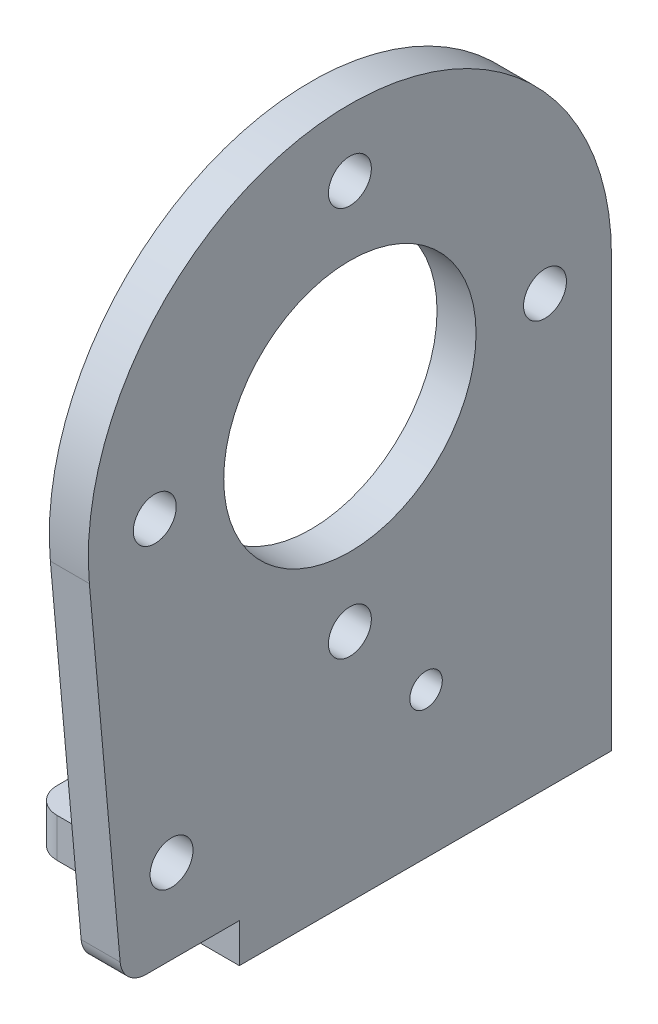
ISO-10303-21;
HEADER;
FILE_DESCRIPTION(('STEP AP214'),'2;1');
FILE_NAME('part.step','',(''),(''),'','','');
FILE_SCHEMA(('AUTOMOTIVE_DESIGN { 1 0 10303 214 1 1 1 1 }'));
ENDSEC;
DATA;
#1=APPLICATION_CONTEXT('core data for automotive mechanical design processes');
#2=APPLICATION_PROTOCOL_DEFINITION('international standard','automotive_design',2000,#1);
#3=PRODUCT_CONTEXT('',#1,'mechanical');
#4=PRODUCT('Part','Part','',(#3));
#5=PRODUCT_RELATED_PRODUCT_CATEGORY('part','',(#4));
#6=PRODUCT_DEFINITION_FORMATION('','',#4);
#7=PRODUCT_DEFINITION_CONTEXT('part definition',#1,'design');
#8=PRODUCT_DEFINITION('design','',#6,#7);
#9=PRODUCT_DEFINITION_SHAPE('','',#8);
#10=(LENGTH_UNIT() NAMED_UNIT(*) SI_UNIT(.MILLI.,.METRE.));
#11=(NAMED_UNIT(*) PLANE_ANGLE_UNIT() SI_UNIT($,.RADIAN.));
#12=(NAMED_UNIT(*) SI_UNIT($,.STERADIAN.) SOLID_ANGLE_UNIT());
#13=UNCERTAINTY_MEASURE_WITH_UNIT(LENGTH_MEASURE(1.E-05),#10,'distance_accuracy_value','');
#14=(GEOMETRIC_REPRESENTATION_CONTEXT(3) GLOBAL_UNCERTAINTY_ASSIGNED_CONTEXT((#13)) GLOBAL_UNIT_ASSIGNED_CONTEXT((#10,
#11,#12)) REPRESENTATION_CONTEXT('',''));
#15=CARTESIAN_POINT('',(0.,0.,0.));
#16=DIRECTION('',(0.,0.,1.));
#17=DIRECTION('',(1.,0.,0.));
#18=AXIS2_PLACEMENT_3D('',#15,#16,#17);
#19=CARTESIAN_POINT('',(-16.,0.,-9.));
#20=DIRECTION('',(0.,0.,-1.));
#21=DIRECTION('',(-1.,0.,0.));
#22=AXIS2_PLACEMENT_3D('',#19,#20,#21);
#23=PLANE('',#22);
#24=DIRECTION('',(1.,0.,0.));
#25=VECTOR('',#24,1.);
#26=CARTESIAN_POINT('',(-16.,13.,-9.));
#27=LINE('',#26,#25);
#28=CARTESIAN_POINT('',(-14.,13.,-9.));
#29=VERTEX_POINT('',#28);
#30=CARTESIAN_POINT('',(-3.,13.,-9.));
#31=VERTEX_POINT('',#30);
#32=EDGE_CURVE('E219',#29,#31,#27,.T.);
#33=ORIENTED_EDGE('',*,*,#32,.F.);
#34=DIRECTION('',(0.,1.,0.));
#35=VECTOR('',#34,1.);
#36=CARTESIAN_POINT('',(-14.,0.,-9.));
#37=LINE('',#36,#35);
#38=CARTESIAN_POINT('',(-14.,10.,-9.));
#39=VERTEX_POINT('',#38);
#40=EDGE_CURVE('E250',#29,#39,#37,.F.);
#41=ORIENTED_EDGE('',*,*,#40,.T.);
#42=DIRECTION('',(1.,0.,0.));
#43=VECTOR('',#42,1.);
#44=CARTESIAN_POINT('',(-16.,10.,-9.));
#45=LINE('',#44,#43);
#46=CARTESIAN_POINT('',(0.,10.,-9.));
#47=VERTEX_POINT('',#46);
#48=EDGE_CURVE('E210',#39,#47,#45,.T.);
#49=ORIENTED_EDGE('',*,*,#48,.T.);
#50=DIRECTION('',(0.,1.,0.));
#51=VECTOR('',#50,1.);
#52=CARTESIAN_POINT('',(0.,0.,-9.));
#53=LINE('',#52,#51);
#54=CARTESIAN_POINT('',(0.,13.,-9.));
#55=VERTEX_POINT('',#54);
#56=EDGE_CURVE('E211',#47,#55,#53,.T.);
#57=ORIENTED_EDGE('',*,*,#56,.T.);
#58=EDGE_CURVE('E222',#31,#55,#27,.T.);
#59=ORIENTED_EDGE('',*,*,#58,.F.);
#60=EDGE_LOOP('',(#33,#41,#49,#57,#59));
#61=FACE_BOUND('',#60,.T.);
#62=ADVANCED_FACE('F37',(#61),#23,.F.);
#63=CARTESIAN_POINT('',(-16.,13.,0.));
#64=DIRECTION('',(0.,-1.,0.));
#65=DIRECTION('',(0.,0.,-1.));
#66=AXIS2_PLACEMENT_3D('',#63,#64,#65);
#67=PLANE('',#66);
#68=CARTESIAN_POINT('',(-11.65,13.,-22.35));
#69=DIRECTION('',(0.,1.,0.));
#70=DIRECTION('',(0.,0.,1.));
#71=AXIS2_PLACEMENT_3D('',#68,#69,#70);
#72=CIRCLE('',#71,1.65);
#73=CARTESIAN_POINT('',(-11.65,13.,-20.7));
#74=VERTEX_POINT('',#73);
#75=EDGE_CURVE('E192',#74,#74,#72,.T.);
#76=ORIENTED_EDGE('',*,*,#75,.F.);
#77=EDGE_LOOP('',(#76));
#78=FACE_BOUND('',#77,.T.);
#79=CARTESIAN_POINT('',(-11.65,13.,-13.6));
#80=DIRECTION('',(0.,1.,0.));
#81=DIRECTION('',(0.,0.,1.));
#82=AXIS2_PLACEMENT_3D('',#79,#80,#81);
#83=CIRCLE('',#82,1.65);
#84=CARTESIAN_POINT('',(-11.65,13.,-11.95));
#85=VERTEX_POINT('',#84);
#86=EDGE_CURVE('E190',#85,#85,#83,.T.);
#87=ORIENTED_EDGE('',*,*,#86,.F.);
#88=EDGE_LOOP('',(#87));
#89=FACE_BOUND('',#88,.T.);
#90=CARTESIAN_POINT('',(-11.65,13.,-31.1));
#91=DIRECTION('',(0.,1.,0.));
#92=DIRECTION('',(0.,0.,1.));
#93=AXIS2_PLACEMENT_3D('',#90,#91,#92);
#94=CIRCLE('',#93,1.65);
#95=CARTESIAN_POINT('',(-11.65,13.,-29.45));
#96=VERTEX_POINT('',#95);
#97=EDGE_CURVE('E198',#96,#96,#94,.T.);
#98=ORIENTED_EDGE('',*,*,#97,.F.);
#99=EDGE_LOOP('',(#98));
#100=FACE_BOUND('',#99,.T.);
#101=DIRECTION('',(1.,0.,0.));
#102=VECTOR('',#101,1.);
#103=CARTESIAN_POINT('',(-16.,13.,-37.61033589));
#104=LINE('',#103,#102);
#105=CARTESIAN_POINT('',(-14.,13.,-37.61033589));
#106=VERTEX_POINT('',#105);
#107=CARTESIAN_POINT('',(-3.,13.,-37.61033589));
#108=VERTEX_POINT('',#107);
#109=EDGE_CURVE('E223',#106,#108,#104,.T.);
#110=ORIENTED_EDGE('',*,*,#109,.F.);
#111=CARTESIAN_POINT('',(-14.,13.,-35.61033589));
#112=DIRECTION('',(0.,-1.,0.));
#113=DIRECTION('',(0.,0.,-1.));
#114=AXIS2_PLACEMENT_3D('',#111,#112,#113);
#115=CIRCLE('',#114,2.);
#116=CARTESIAN_POINT('',(-16.,13.,-35.61033589));
#117=VERTEX_POINT('',#116);
#118=EDGE_CURVE('E248',#106,#117,#115,.F.);
#119=ORIENTED_EDGE('',*,*,#118,.T.);
#120=DIRECTION('',(0.,0.,-1.));
#121=VECTOR('',#120,1.);
#122=CARTESIAN_POINT('',(-16.,13.,0.));
#123=LINE('',#122,#121);
#124=CARTESIAN_POINT('',(-16.,13.,-11.));
#125=VERTEX_POINT('',#124);
#126=EDGE_CURVE('E206',#125,#117,#123,.T.);
#127=ORIENTED_EDGE('',*,*,#126,.F.);
#128=CARTESIAN_POINT('',(-14.,13.,-11.));
#129=DIRECTION('',(0.,-1.,0.));
#130=DIRECTION('',(0.,0.,-1.));
#131=AXIS2_PLACEMENT_3D('',#128,#129,#130);
#132=CIRCLE('',#131,2.);
#133=EDGE_CURVE('E246',#125,#29,#132,.F.);
#134=ORIENTED_EDGE('',*,*,#133,.T.);
#135=ORIENTED_EDGE('',*,*,#32,.T.);
#136=DIRECTION('',(0.,0.,-1.));
#137=VECTOR('',#136,1.);
#138=CARTESIAN_POINT('',(-3.,13.,0.));
#139=LINE('',#138,#137);
#140=EDGE_CURVE('E150',#31,#108,#139,.T.);
#141=ORIENTED_EDGE('',*,*,#140,.T.);
#142=EDGE_LOOP('',(#110,#119,#127,#134,#135,#141));
#143=FACE_BOUND('',#142,.T.);
#144=ADVANCED_FACE('F267',(#78,#89,#100,#143),#67,.F.);
#145=CARTESIAN_POINT('',(-16.,0.,-37.61033589));
#146=DIRECTION('',(0.,0.,1.));
#147=DIRECTION('',(1.,0.,0.));
#148=AXIS2_PLACEMENT_3D('',#145,#146,#147);
#149=PLANE('',#148);
#150=DIRECTION('',(1.,0.,0.));
#151=VECTOR('',#150,1.);
#152=CARTESIAN_POINT('',(-16.,10.,-37.61033589));
#153=LINE('',#152,#151);
#154=CARTESIAN_POINT('',(-14.,10.,-37.61033589));
#155=VERTEX_POINT('',#154);
#156=CARTESIAN_POINT('',(0.,10.,-37.61033589));
#157=VERTEX_POINT('',#156);
#158=EDGE_CURVE('E225',#155,#157,#153,.T.);
#159=ORIENTED_EDGE('',*,*,#158,.F.);
#160=DIRECTION('',(0.,-1.,0.));
#161=VECTOR('',#160,1.);
#162=CARTESIAN_POINT('',(-14.,0.,-37.61033589));
#163=LINE('',#162,#161);
#164=EDGE_CURVE('E244',#155,#106,#163,.F.);
#165=ORIENTED_EDGE('',*,*,#164,.T.);
#166=ORIENTED_EDGE('',*,*,#109,.T.);
#167=DIRECTION('',(0.,-1.,0.));
#168=VECTOR('',#167,1.);
#169=CARTESIAN_POINT('',(-3.,0.,-37.6103358895748));
#170=LINE('',#169,#168);
#171=CARTESIAN_POINT('',(-3.,42.99965258,-37.6103358895748));
#172=VERTEX_POINT('',#171);
#173=EDGE_CURVE('E149',#172,#108,#170,.T.);
#174=ORIENTED_EDGE('',*,*,#173,.F.);
#175=DIRECTION('',(1.,0.,0.));
#176=VECTOR('',#175,1.);
#177=CARTESIAN_POINT('',(-3.,42.99965258,-37.6103358895748));
#178=LINE('',#177,#176);
#179=CARTESIAN_POINT('',(0.,42.99965258,-37.6103358895748));
#180=VERTEX_POINT('',#179);
#181=EDGE_CURVE('E135',#172,#180,#178,.T.);
#182=ORIENTED_EDGE('',*,*,#181,.T.);
#183=DIRECTION('',(0.,-1.,0.));
#184=VECTOR('',#183,1.);
#185=CARTESIAN_POINT('',(0.,0.,-37.61033589));
#186=LINE('',#185,#184);
#187=EDGE_CURVE('E207',#180,#157,#186,.T.);
#188=ORIENTED_EDGE('',*,*,#187,.T.);
#189=EDGE_LOOP('',(#159,#165,#166,#174,#182,#188));
#190=FACE_BOUND('',#189,.T.);
#191=ADVANCED_FACE('F261',(#190),#149,.F.);
#192=CARTESIAN_POINT('',(-16.,10.,0.));
#193=DIRECTION('',(0.,-1.,0.));
#194=DIRECTION('',(0.,0.,-1.));
#195=AXIS2_PLACEMENT_3D('',#192,#193,#194);
#196=PLANE('',#195);
#197=CARTESIAN_POINT('',(-11.65,10.,-22.35));
#198=DIRECTION('',(0.,-1.,0.));
#199=DIRECTION('',(0.,0.,-1.));
#200=AXIS2_PLACEMENT_3D('',#197,#198,#199);
#201=CIRCLE('',#200,1.65);
#202=CARTESIAN_POINT('',(-11.65,10.,-24.));
#203=VERTEX_POINT('',#202);
#204=EDGE_CURVE('E202',#203,#203,#201,.T.);
#205=ORIENTED_EDGE('',*,*,#204,.F.);
#206=EDGE_LOOP('',(#205));
#207=FACE_BOUND('',#206,.T.);
#208=CARTESIAN_POINT('',(-11.65,10.,-13.6));
#209=DIRECTION('',(0.,-1.,0.));
#210=DIRECTION('',(0.,0.,-1.));
#211=AXIS2_PLACEMENT_3D('',#208,#209,#210);
#212=CIRCLE('',#211,1.65);
#213=CARTESIAN_POINT('',(-11.65,10.,-15.25));
#214=VERTEX_POINT('',#213);
#215=EDGE_CURVE('E195',#214,#214,#212,.T.);
#216=ORIENTED_EDGE('',*,*,#215,.F.);
#217=EDGE_LOOP('',(#216));
#218=FACE_BOUND('',#217,.T.);
#219=CARTESIAN_POINT('',(-11.65,10.,-31.1));
#220=DIRECTION('',(0.,-1.,0.));
#221=DIRECTION('',(0.,0.,-1.));
#222=AXIS2_PLACEMENT_3D('',#219,#220,#221);
#223=CIRCLE('',#222,1.65);
#224=CARTESIAN_POINT('',(-11.65,10.,-32.75));
#225=VERTEX_POINT('',#224);
#226=EDGE_CURVE('E201',#225,#225,#223,.T.);
#227=ORIENTED_EDGE('',*,*,#226,.F.);
#228=EDGE_LOOP('',(#227));
#229=FACE_BOUND('',#228,.T.);
#230=DIRECTION('',(0.,0.,-1.));
#231=VECTOR('',#230,1.);
#232=CARTESIAN_POINT('',(-16.,10.,0.));
#233=LINE('',#232,#231);
#234=CARTESIAN_POINT('',(-16.,10.,-11.));
#235=VERTEX_POINT('',#234);
#236=CARTESIAN_POINT('',(-16.,10.,-35.61033589));
#237=VERTEX_POINT('',#236);
#238=EDGE_CURVE('E203',#235,#237,#233,.T.);
#239=ORIENTED_EDGE('',*,*,#238,.T.);
#240=CARTESIAN_POINT('',(-14.,10.,-35.61033589));
#241=DIRECTION('',(0.,-1.,0.));
#242=DIRECTION('',(0.,0.,-1.));
#243=AXIS2_PLACEMENT_3D('',#240,#241,#242);
#244=CIRCLE('',#243,2.);
#245=EDGE_CURVE('E242',#237,#155,#244,.T.);
#246=ORIENTED_EDGE('',*,*,#245,.T.);
#247=ORIENTED_EDGE('',*,*,#158,.T.);
#248=DIRECTION('',(0.,0.,-1.));
#249=VECTOR('',#248,1.);
#250=CARTESIAN_POINT('',(0.,10.,0.));
#251=LINE('',#250,#249);
#252=EDGE_CURVE('E214',#47,#157,#251,.T.);
#253=ORIENTED_EDGE('',*,*,#252,.F.);
#254=ORIENTED_EDGE('',*,*,#48,.F.);
#255=CARTESIAN_POINT('',(-14.,10.,-11.));
#256=DIRECTION('',(0.,-1.,0.));
#257=DIRECTION('',(0.,0.,-1.));
#258=AXIS2_PLACEMENT_3D('',#255,#256,#257);
#259=CIRCLE('',#258,2.);
#260=EDGE_CURVE('E240',#39,#235,#259,.T.);
#261=ORIENTED_EDGE('',*,*,#260,.T.);
#262=EDGE_LOOP('',(#239,#246,#247,#253,#254,#261));
#263=FACE_BOUND('',#262,.T.);
#264=ADVANCED_FACE('F281',(#207,#218,#229,#263),#196,.T.);
#265=CARTESIAN_POINT('',(-16.,0.,0.));
#266=DIRECTION('',(1.,0.,0.));
#267=DIRECTION('',(0.,0.,-1.));
#268=AXIS2_PLACEMENT_3D('',#265,#266,#267);
#269=PLANE('',#268);
#270=ORIENTED_EDGE('',*,*,#126,.T.);
#271=DIRECTION('',(0.,-1.,0.));
#272=VECTOR('',#271,1.);
#273=CARTESIAN_POINT('',(-16.,0.,-35.61033589));
#274=LINE('',#273,#272);
#275=EDGE_CURVE('E237',#117,#237,#274,.T.);
#276=ORIENTED_EDGE('',*,*,#275,.T.);
#277=ORIENTED_EDGE('',*,*,#238,.F.);
#278=DIRECTION('',(0.,1.,0.));
#279=VECTOR('',#278,1.);
#280=CARTESIAN_POINT('',(-16.,0.,-11.));
#281=LINE('',#280,#279);
#282=EDGE_CURVE('E234',#235,#125,#281,.T.);
#283=ORIENTED_EDGE('',*,*,#282,.T.);
#284=EDGE_LOOP('',(#270,#276,#277,#283));
#285=FACE_BOUND('',#284,.T.);
#286=ADVANCED_FACE('F283',(#285),#269,.F.);
#287=CARTESIAN_POINT('',(0.,0.,0.));
#288=DIRECTION('',(1.,0.,0.));
#289=DIRECTION('',(0.,0.,-1.));
#290=AXIS2_PLACEMENT_3D('',#287,#288,#289);
#291=PLANE('',#290);
#292=DIRECTION('',(0.,0.995999475367037,0.0893590793852966));
#293=VECTOR('',#292,1.);
#294=CARTESIAN_POINT('',(0.,0.103805585891641,-1.15702075043148));
#295=LINE('',#294,#293);
#296=CARTESIAN_POINT('',(0.,14.8212818412294,0.163401761404988));
#297=VERTEX_POINT('',#296);
#298=CARTESIAN_POINT('',(0.,41.2025937383205,2.53028026124727));
#299=VERTEX_POINT('',#298);
#300=EDGE_CURVE('E131',#297,#299,#295,.T.);
#301=ORIENTED_EDGE('',*,*,#300,.F.);
#302=CARTESIAN_POINT('',(0.,15.,-1.82859718932909));
#303=DIRECTION('',(1.,0.,0.));
#304=DIRECTION('',(0.,0.,-1.));
#305=AXIS2_PLACEMENT_3D('',#302,#303,#304);
#306=CIRCLE('',#305,2.);
#307=CARTESIAN_POINT('',(0.,13.,-1.82859718932909));
#308=VERTEX_POINT('',#307);
#309=EDGE_CURVE('E59',#297,#308,#306,.T.);
#310=ORIENTED_EDGE('',*,*,#309,.T.);
#311=DIRECTION('',(0.,0.,-1.));
#312=VECTOR('',#311,1.);
#313=CARTESIAN_POINT('',(0.,13.,0.));
#314=LINE('',#313,#312);
#315=EDGE_CURVE('E175',#308,#55,#314,.T.);
#316=ORIENTED_EDGE('',*,*,#315,.T.);
#317=ORIENTED_EDGE('',*,*,#56,.F.);
#318=ORIENTED_EDGE('',*,*,#252,.T.);
#319=ORIENTED_EDGE('',*,*,#187,.F.);
#320=CARTESIAN_POINT('',(0.,42.99965258,-17.49980147));
#321=DIRECTION('',(1.,0.,0.));
#322=DIRECTION('',(0.,0.,-1.));
#323=AXIS2_PLACEMENT_3D('',#320,#321,#322);
#324=CIRCLE('',#323,20.1105344195748);
#325=EDGE_CURVE('E172',#180,#299,#324,.T.);
#326=ORIENTED_EDGE('',*,*,#325,.T.);
#327=EDGE_LOOP('',(#301,#310,#316,#317,#318,#319,#326));
#328=FACE_BOUND('',#327,.T.);
#329=CARTESIAN_POINT('',(0.,57.99965258,-17.49980147));
#330=DIRECTION('',(1.,0.,0.));
#331=DIRECTION('',(0.,0.,-1.));
#332=AXIS2_PLACEMENT_3D('',#329,#330,#331);
#333=CIRCLE('',#332,1.65);
#334=CARTESIAN_POINT('',(0.,57.99965258,-19.14980147));
#335=VERTEX_POINT('',#334);
#336=EDGE_CURVE('E163',#335,#335,#333,.T.);
#337=ORIENTED_EDGE('',*,*,#336,.F.);
#338=EDGE_LOOP('',(#337));
#339=FACE_BOUND('',#338,.T.);
#340=CARTESIAN_POINT('',(0.,42.99965258,-32.49980147));
#341=DIRECTION('',(1.,0.,0.));
#342=DIRECTION('',(0.,0.,-1.));
#343=AXIS2_PLACEMENT_3D('',#340,#341,#342);
#344=CIRCLE('',#343,1.65);
#345=CARTESIAN_POINT('',(0.,42.99965258,-34.14980147));
#346=VERTEX_POINT('',#345);
#347=EDGE_CURVE('E166',#346,#346,#344,.T.);
#348=ORIENTED_EDGE('',*,*,#347,.F.);
#349=EDGE_LOOP('',(#348));
#350=FACE_BOUND('',#349,.T.);
#351=CARTESIAN_POINT('',(0.,27.99965258,-17.49980147));
#352=DIRECTION('',(1.,0.,0.));
#353=DIRECTION('',(0.,0.,-1.));
#354=AXIS2_PLACEMENT_3D('',#351,#352,#353);
#355=CIRCLE('',#354,1.65);
#356=CARTESIAN_POINT('',(0.,27.99965258,-19.14980147));
#357=VERTEX_POINT('',#356);
#358=EDGE_CURVE('E169',#357,#357,#355,.T.);
#359=ORIENTED_EDGE('',*,*,#358,.F.);
#360=EDGE_LOOP('',(#359));
#361=FACE_BOUND('',#360,.T.);
#362=CARTESIAN_POINT('',(0.,19.4720110444833,-3.78861061643414));
#363=DIRECTION('',(1.,0.,0.));
#364=DIRECTION('',(0.,0.,-1.));
#365=AXIS2_PLACEMENT_3D('',#362,#363,#364);
#366=CIRCLE('',#365,1.65);
#367=CARTESIAN_POINT('',(0.,19.4720110444833,-5.43861061643414));
#368=VERTEX_POINT('',#367);
#369=EDGE_CURVE('E177',#368,#368,#366,.T.);
#370=ORIENTED_EDGE('',*,*,#369,.F.);
#371=EDGE_LOOP('',(#370));
#372=FACE_BOUND('',#371,.T.);
#373=CARTESIAN_POINT('',(0.,21.1973949058091,-23.3549357370242));
#374=DIRECTION('',(1.,0.,0.));
#375=DIRECTION('',(0.,0.,-1.));
#376=AXIS2_PLACEMENT_3D('',#373,#374,#375);
#377=CIRCLE('',#376,1.25);
#378=CARTESIAN_POINT('',(0.,21.1973949058091,-24.6049357370242));
#379=VERTEX_POINT('',#378);
#380=EDGE_CURVE('E180',#379,#379,#377,.T.);
#381=ORIENTED_EDGE('',*,*,#380,.F.);
#382=EDGE_LOOP('',(#381));
#383=FACE_BOUND('',#382,.T.);
#384=CARTESIAN_POINT('',(0.,42.99965258,-2.49980147));
#385=DIRECTION('',(1.,0.,0.));
#386=DIRECTION('',(0.,0.,-1.));
#387=AXIS2_PLACEMENT_3D('',#384,#385,#386);
#388=CIRCLE('',#387,1.65);
#389=CARTESIAN_POINT('',(0.,42.99965258,-4.14980147));
#390=VERTEX_POINT('',#389);
#391=EDGE_CURVE('E183',#390,#390,#388,.T.);
#392=ORIENTED_EDGE('',*,*,#391,.F.);
#393=EDGE_LOOP('',(#392));
#394=FACE_BOUND('',#393,.T.);
#395=CARTESIAN_POINT('',(0.,42.99965258,-17.49980147));
#396=DIRECTION('',(1.,0.,0.));
#397=DIRECTION('',(0.,0.,-1.));
#398=AXIS2_PLACEMENT_3D('',#395,#396,#397);
#399=CIRCLE('',#398,9.7);
#400=CARTESIAN_POINT('',(0.,42.99965258,-27.19980147));
#401=VERTEX_POINT('',#400);
#402=EDGE_CURVE('E186',#401,#401,#399,.T.);
#403=ORIENTED_EDGE('',*,*,#402,.F.);
#404=EDGE_LOOP('',(#403));
#405=FACE_BOUND('',#404,.T.);
#406=ADVANCED_FACE('F255',(#328,#339,#350,#361,#372,#383,#394,#405),#291,.T.);
#407=CARTESIAN_POINT('',(-11.65,3.,-31.1));
#408=DIRECTION('',(0.,1.,0.));
#409=DIRECTION('',(0.,0.,1.));
#410=AXIS2_PLACEMENT_3D('',#407,#408,#409);
#411=CYLINDRICAL_SURFACE('',#410,1.65);
#412=ORIENTED_EDGE('',*,*,#226,.T.);
#413=EDGE_LOOP('',(#412));
#414=FACE_BOUND('',#413,.T.);
#415=ORIENTED_EDGE('',*,*,#97,.T.);
#416=EDGE_LOOP('',(#415));
#417=FACE_BOUND('',#416,.T.);
#418=ADVANCED_FACE('F312',(#414,#417),#411,.F.);
#419=CARTESIAN_POINT('',(-11.65,3.,-13.6));
#420=DIRECTION('',(0.,1.,0.));
#421=DIRECTION('',(0.,0.,1.));
#422=AXIS2_PLACEMENT_3D('',#419,#420,#421);
#423=CYLINDRICAL_SURFACE('',#422,1.65);
#424=ORIENTED_EDGE('',*,*,#215,.T.);
#425=EDGE_LOOP('',(#424));
#426=FACE_BOUND('',#425,.T.);
#427=ORIENTED_EDGE('',*,*,#86,.T.);
#428=EDGE_LOOP('',(#427));
#429=FACE_BOUND('',#428,.T.);
#430=ADVANCED_FACE('F317',(#426,#429),#423,.F.);
#431=CARTESIAN_POINT('',(-11.65,3.,-22.35));
#432=DIRECTION('',(0.,1.,0.));
#433=DIRECTION('',(0.,0.,1.));
#434=AXIS2_PLACEMENT_3D('',#431,#432,#433);
#435=CYLINDRICAL_SURFACE('',#434,1.65);
#436=ORIENTED_EDGE('',*,*,#204,.T.);
#437=EDGE_LOOP('',(#436));
#438=FACE_BOUND('',#437,.T.);
#439=ORIENTED_EDGE('',*,*,#75,.T.);
#440=EDGE_LOOP('',(#439));
#441=FACE_BOUND('',#440,.T.);
#442=ADVANCED_FACE('F321',(#438,#441),#435,.F.);
#443=CARTESIAN_POINT('',(-3.,42.99965258,-17.49980147));
#444=DIRECTION('',(1.,0.,0.));
#445=DIRECTION('',(0.,0.,-1.));
#446=AXIS2_PLACEMENT_3D('',#443,#444,#445);
#447=CYLINDRICAL_SURFACE('',#446,20.1105344195748);
#448=ORIENTED_EDGE('',*,*,#325,.F.);
#449=ORIENTED_EDGE('',*,*,#181,.F.);
#450=CARTESIAN_POINT('',(-3.,42.99965258,-17.49980147));
#451=DIRECTION('',(1.,0.,0.));
#452=DIRECTION('',(0.,0.,-1.));
#453=AXIS2_PLACEMENT_3D('',#450,#451,#452);
#454=CIRCLE('',#453,20.1105344195748);
#455=CARTESIAN_POINT('',(-3.,41.2025937383205,2.53028026124727));
#456=VERTEX_POINT('',#455);
#457=EDGE_CURVE('E121',#172,#456,#454,.T.);
#458=ORIENTED_EDGE('',*,*,#457,.T.);
#459=DIRECTION('',(1.,0.,0.));
#460=VECTOR('',#459,1.);
#461=CARTESIAN_POINT('',(-3.,41.2025937383205,2.53028026124727));
#462=LINE('',#461,#460);
#463=EDGE_CURVE('E129',#456,#299,#462,.T.);
#464=ORIENTED_EDGE('',*,*,#463,.T.);
#465=EDGE_LOOP('',(#448,#449,#458,#464));
#466=FACE_BOUND('',#465,.T.);
#467=ADVANCED_FACE('F138',(#466),#447,.T.);
#468=CARTESIAN_POINT('',(-3.,13.,0.));
#469=DIRECTION('',(0.,-1.,0.));
#470=DIRECTION('',(0.,0.,-1.));
#471=AXIS2_PLACEMENT_3D('',#468,#469,#470);
#472=PLANE('',#471);
#473=ORIENTED_EDGE('',*,*,#315,.F.);
#474=DIRECTION('',(1.,0.,0.));
#475=VECTOR('',#474,1.);
#476=CARTESIAN_POINT('',(-3.,13.,-1.82859718932909));
#477=LINE('',#476,#475);
#478=CARTESIAN_POINT('',(-3.,13.,-1.82859718932909));
#479=VERTEX_POINT('',#478);
#480=EDGE_CURVE('E45',#308,#479,#477,.F.);
#481=ORIENTED_EDGE('',*,*,#480,.T.);
#482=EDGE_CURVE('E126',#479,#31,#139,.T.);
#483=ORIENTED_EDGE('',*,*,#482,.T.);
#484=ORIENTED_EDGE('',*,*,#58,.T.);
#485=EDGE_LOOP('',(#473,#481,#483,#484));
#486=FACE_BOUND('',#485,.T.);
#487=ADVANCED_FACE('F340',(#486),#472,.T.);
#488=CARTESIAN_POINT('',(-3.,42.99965258,-2.49980147));
#489=DIRECTION('',(1.,0.,0.));
#490=DIRECTION('',(0.,0.,-1.));
#491=AXIS2_PLACEMENT_3D('',#488,#489,#490);
#492=CYLINDRICAL_SURFACE('',#491,1.65);
#493=CARTESIAN_POINT('',(-3.,42.99965258,-2.49980147));
#494=DIRECTION('',(1.,0.,0.));
#495=DIRECTION('',(0.,0.,-1.));
#496=AXIS2_PLACEMENT_3D('',#493,#494,#495);
#497=CIRCLE('',#496,1.65);
#498=CARTESIAN_POINT('',(-3.,42.99965258,-4.14980147));
#499=VERTEX_POINT('',#498);
#500=EDGE_CURVE('E158',#499,#499,#497,.T.);
#501=ORIENTED_EDGE('',*,*,#500,.F.);
#502=EDGE_LOOP('',(#501));
#503=FACE_BOUND('',#502,.T.);
#504=ORIENTED_EDGE('',*,*,#391,.T.);
#505=EDGE_LOOP('',(#504));
#506=FACE_BOUND('',#505,.T.);
#507=ADVANCED_FACE('F346',(#503,#506),#492,.F.);
#508=CARTESIAN_POINT('',(-3.,21.1973949058091,-23.3549357370242));
#509=DIRECTION('',(1.,0.,0.));
#510=DIRECTION('',(0.,0.,-1.));
#511=AXIS2_PLACEMENT_3D('',#508,#509,#510);
#512=CYLINDRICAL_SURFACE('',#511,1.25);
#513=CARTESIAN_POINT('',(-3.,21.1973949058091,-23.3549357370242));
#514=DIRECTION('',(1.,0.,0.));
#515=DIRECTION('',(0.,0.,-1.));
#516=AXIS2_PLACEMENT_3D('',#513,#514,#515);
#517=CIRCLE('',#516,1.25);
#518=CARTESIAN_POINT('',(-3.,21.1973949058091,-24.6049357370242));
#519=VERTEX_POINT('',#518);
#520=EDGE_CURVE('E155',#519,#519,#517,.T.);
#521=ORIENTED_EDGE('',*,*,#520,.F.);
#522=EDGE_LOOP('',(#521));
#523=FACE_BOUND('',#522,.T.);
#524=ORIENTED_EDGE('',*,*,#380,.T.);
#525=EDGE_LOOP('',(#524));
#526=FACE_BOUND('',#525,.T.);
#527=ADVANCED_FACE('F349',(#523,#526),#512,.F.);
#528=CARTESIAN_POINT('',(-3.,19.4720110444833,-3.78861061643414));
#529=DIRECTION('',(1.,0.,0.));
#530=DIRECTION('',(0.,0.,-1.));
#531=AXIS2_PLACEMENT_3D('',#528,#529,#530);
#532=CYLINDRICAL_SURFACE('',#531,1.65);
#533=CARTESIAN_POINT('',(-3.,19.4720110444833,-3.78861061643414));
#534=DIRECTION('',(1.,0.,0.));
#535=DIRECTION('',(0.,0.,-1.));
#536=AXIS2_PLACEMENT_3D('',#533,#534,#535);
#537=CIRCLE('',#536,1.65);
#538=CARTESIAN_POINT('',(-3.,19.4720110444833,-5.43861061643414));
#539=VERTEX_POINT('',#538);
#540=EDGE_CURVE('E152',#539,#539,#537,.T.);
#541=ORIENTED_EDGE('',*,*,#540,.F.);
#542=EDGE_LOOP('',(#541));
#543=FACE_BOUND('',#542,.T.);
#544=ORIENTED_EDGE('',*,*,#369,.T.);
#545=EDGE_LOOP('',(#544));
#546=FACE_BOUND('',#545,.T.);
#547=ADVANCED_FACE('F343',(#543,#546),#532,.F.);
#548=CARTESIAN_POINT('',(-3.,0.103805585891641,-1.15702075043148));
#549=DIRECTION('',(0.,0.0893590793852966,-0.995999475367037));
#550=DIRECTION('',(0.,0.995999475367037,0.0893590793852966));
#551=AXIS2_PLACEMENT_3D('',#548,#549,#550);
#552=PLANE('',#551);
#553=DIRECTION('',(0.,0.995999475367037,0.0893590793852966));
#554=VECTOR('',#553,1.);
#555=CARTESIAN_POINT('',(-3.,0.103805585891641,-1.15702075043148));
#556=LINE('',#555,#554);
#557=CARTESIAN_POINT('',(-3.,14.8212818412294,0.163401761404988));
#558=VERTEX_POINT('',#557);
#559=EDGE_CURVE('E115',#558,#456,#556,.T.);
#560=ORIENTED_EDGE('',*,*,#559,.F.);
#561=DIRECTION('',(1.,0.,0.));
#562=VECTOR('',#561,1.);
#563=CARTESIAN_POINT('',(0.,14.8212818412294,0.163401761404988));
#564=LINE('',#563,#562);
#565=EDGE_CURVE('E252',#558,#297,#564,.T.);
#566=ORIENTED_EDGE('',*,*,#565,.T.);
#567=ORIENTED_EDGE('',*,*,#300,.T.);
#568=ORIENTED_EDGE('',*,*,#463,.F.);
#569=EDGE_LOOP('',(#560,#566,#567,#568));
#570=FACE_BOUND('',#569,.T.);
#571=ADVANCED_FACE('F130',(#570),#552,.F.);
#572=CARTESIAN_POINT('',(-3.,27.99965258,-17.49980147));
#573=DIRECTION('',(1.,0.,0.));
#574=DIRECTION('',(0.,0.,-1.));
#575=AXIS2_PLACEMENT_3D('',#572,#573,#574);
#576=CYLINDRICAL_SURFACE('',#575,1.65);
#577=CARTESIAN_POINT('',(-3.,27.99965258,-17.49980147));
#578=DIRECTION('',(1.,0.,0.));
#579=DIRECTION('',(0.,0.,-1.));
#580=AXIS2_PLACEMENT_3D('',#577,#578,#579);
#581=CIRCLE('',#580,1.65);
#582=CARTESIAN_POINT('',(-3.,27.99965258,-19.14980147));
#583=VERTEX_POINT('',#582);
#584=EDGE_CURVE('E141',#583,#583,#581,.T.);
#585=ORIENTED_EDGE('',*,*,#584,.F.);
#586=EDGE_LOOP('',(#585));
#587=FACE_BOUND('',#586,.T.);
#588=ORIENTED_EDGE('',*,*,#358,.T.);
#589=EDGE_LOOP('',(#588));
#590=FACE_BOUND('',#589,.T.);
#591=ADVANCED_FACE('F333',(#587,#590),#576,.F.);
#592=CARTESIAN_POINT('',(-3.,42.99965258,-32.49980147));
#593=DIRECTION('',(1.,0.,0.));
#594=DIRECTION('',(0.,0.,-1.));
#595=AXIS2_PLACEMENT_3D('',#592,#593,#594);
#596=CYLINDRICAL_SURFACE('',#595,1.65);
#597=CARTESIAN_POINT('',(-3.,42.99965258,-32.49980147));
#598=DIRECTION('',(1.,0.,0.));
#599=DIRECTION('',(0.,0.,-1.));
#600=AXIS2_PLACEMENT_3D('',#597,#598,#599);
#601=CIRCLE('',#600,1.65);
#602=CARTESIAN_POINT('',(-3.,42.99965258,-34.14980147));
#603=VERTEX_POINT('',#602);
#604=EDGE_CURVE('E144',#603,#603,#601,.T.);
#605=ORIENTED_EDGE('',*,*,#604,.F.);
#606=EDGE_LOOP('',(#605));
#607=FACE_BOUND('',#606,.T.);
#608=ORIENTED_EDGE('',*,*,#347,.T.);
#609=EDGE_LOOP('',(#608));
#610=FACE_BOUND('',#609,.T.);
#611=ADVANCED_FACE('F329',(#607,#610),#596,.F.);
#612=CARTESIAN_POINT('',(-3.,57.99965258,-17.49980147));
#613=DIRECTION('',(1.,0.,0.));
#614=DIRECTION('',(0.,0.,-1.));
#615=AXIS2_PLACEMENT_3D('',#612,#613,#614);
#616=CYLINDRICAL_SURFACE('',#615,1.65);
#617=CARTESIAN_POINT('',(-3.,57.99965258,-17.49980147));
#618=DIRECTION('',(1.,0.,0.));
#619=DIRECTION('',(0.,0.,-1.));
#620=AXIS2_PLACEMENT_3D('',#617,#618,#619);
#621=CIRCLE('',#620,1.65);
#622=CARTESIAN_POINT('',(-3.,57.99965258,-19.14980147));
#623=VERTEX_POINT('',#622);
#624=EDGE_CURVE('E189',#623,#623,#621,.T.);
#625=ORIENTED_EDGE('',*,*,#624,.F.);
#626=EDGE_LOOP('',(#625));
#627=FACE_BOUND('',#626,.T.);
#628=ORIENTED_EDGE('',*,*,#336,.T.);
#629=EDGE_LOOP('',(#628));
#630=FACE_BOUND('',#629,.T.);
#631=ADVANCED_FACE('F326',(#627,#630),#616,.F.);
#632=CARTESIAN_POINT('',(-3.,42.99965258,-17.49980147));
#633=DIRECTION('',(1.,0.,0.));
#634=DIRECTION('',(0.,0.,-1.));
#635=AXIS2_PLACEMENT_3D('',#632,#633,#634);
#636=CYLINDRICAL_SURFACE('',#635,9.7);
#637=CARTESIAN_POINT('',(-3.,42.99965258,-17.49980147));
#638=DIRECTION('',(1.,0.,0.));
#639=DIRECTION('',(0.,0.,-1.));
#640=AXIS2_PLACEMENT_3D('',#637,#638,#639);
#641=CIRCLE('',#640,9.7);
#642=CARTESIAN_POINT('',(-3.,42.99965258,-27.19980147));
#643=VERTEX_POINT('',#642);
#644=EDGE_CURVE('E136',#643,#643,#641,.T.);
#645=ORIENTED_EDGE('',*,*,#644,.F.);
#646=EDGE_LOOP('',(#645));
#647=FACE_BOUND('',#646,.T.);
#648=ORIENTED_EDGE('',*,*,#402,.T.);
#649=EDGE_LOOP('',(#648));
#650=FACE_BOUND('',#649,.T.);
#651=ADVANCED_FACE('F294',(#647,#650),#636,.F.);
#652=CARTESIAN_POINT('',(-3.,0.,0.));
#653=DIRECTION('',(1.,0.,0.));
#654=DIRECTION('',(0.,0.,-1.));
#655=AXIS2_PLACEMENT_3D('',#652,#653,#654);
#656=PLANE('',#655);
#657=ORIENTED_EDGE('',*,*,#624,.T.);
#658=EDGE_LOOP('',(#657));
#659=FACE_BOUND('',#658,.T.);
#660=ORIENTED_EDGE('',*,*,#604,.T.);
#661=EDGE_LOOP('',(#660));
#662=FACE_BOUND('',#661,.T.);
#663=ORIENTED_EDGE('',*,*,#584,.T.);
#664=EDGE_LOOP('',(#663));
#665=FACE_BOUND('',#664,.T.);
#666=ORIENTED_EDGE('',*,*,#482,.F.);
#667=CARTESIAN_POINT('',(-3.,15.,-1.82859718932909));
#668=DIRECTION('',(1.,0.,0.));
#669=DIRECTION('',(0.,0.,-1.));
#670=AXIS2_PLACEMENT_3D('',#667,#668,#669);
#671=CIRCLE('',#670,2.);
#672=EDGE_CURVE('E11',#479,#558,#671,.F.);
#673=ORIENTED_EDGE('',*,*,#672,.T.);
#674=ORIENTED_EDGE('',*,*,#559,.T.);
#675=ORIENTED_EDGE('',*,*,#457,.F.);
#676=ORIENTED_EDGE('',*,*,#173,.T.);
#677=ORIENTED_EDGE('',*,*,#140,.F.);
#678=EDGE_LOOP('',(#666,#673,#674,#675,#676,#677));
#679=FACE_BOUND('',#678,.T.);
#680=ORIENTED_EDGE('',*,*,#540,.T.);
#681=EDGE_LOOP('',(#680));
#682=FACE_BOUND('',#681,.T.);
#683=ORIENTED_EDGE('',*,*,#520,.T.);
#684=EDGE_LOOP('',(#683));
#685=FACE_BOUND('',#684,.T.);
#686=ORIENTED_EDGE('',*,*,#500,.T.);
#687=EDGE_LOOP('',(#686));
#688=FACE_BOUND('',#687,.T.);
#689=ORIENTED_EDGE('',*,*,#644,.T.);
#690=EDGE_LOOP('',(#689));
#691=FACE_BOUND('',#690,.T.);
#692=ADVANCED_FACE('F117',(#659,#662,#665,#679,#682,#685,#688,#691),#656,.F.);
#693=CARTESIAN_POINT('',(-14.,0.,-35.61033589));
#694=DIRECTION('',(0.,-1.,0.));
#695=DIRECTION('',(0.,0.,-1.));
#696=AXIS2_PLACEMENT_3D('',#693,#694,#695);
#697=CYLINDRICAL_SURFACE('',#696,2.);
#698=ORIENTED_EDGE('',*,*,#118,.F.);
#699=ORIENTED_EDGE('',*,*,#164,.F.);
#700=ORIENTED_EDGE('',*,*,#245,.F.);
#701=ORIENTED_EDGE('',*,*,#275,.F.);
#702=EDGE_LOOP('',(#698,#699,#700,#701));
#703=FACE_BOUND('',#702,.T.);
#704=ADVANCED_FACE('F286',(#703),#697,.T.);
#705=CARTESIAN_POINT('',(-14.,0.,-11.));
#706=DIRECTION('',(0.,1.,0.));
#707=DIRECTION('',(0.,0.,1.));
#708=AXIS2_PLACEMENT_3D('',#705,#706,#707);
#709=CYLINDRICAL_SURFACE('',#708,2.);
#710=ORIENTED_EDGE('',*,*,#260,.F.);
#711=ORIENTED_EDGE('',*,*,#40,.F.);
#712=ORIENTED_EDGE('',*,*,#133,.F.);
#713=ORIENTED_EDGE('',*,*,#282,.F.);
#714=EDGE_LOOP('',(#710,#711,#712,#713));
#715=FACE_BOUND('',#714,.T.);
#716=ADVANCED_FACE('F277',(#715),#709,.T.);
#717=CARTESIAN_POINT('',(-3.,15.,-1.82859718932909));
#718=DIRECTION('',(-1.,0.,0.));
#719=DIRECTION('',(0.,0.,1.));
#720=AXIS2_PLACEMENT_3D('',#717,#718,#719);
#721=CYLINDRICAL_SURFACE('',#720,2.);
#722=ORIENTED_EDGE('',*,*,#672,.F.);
#723=ORIENTED_EDGE('',*,*,#480,.F.);
#724=ORIENTED_EDGE('',*,*,#309,.F.);
#725=ORIENTED_EDGE('',*,*,#565,.F.);
#726=EDGE_LOOP('',(#722,#723,#724,#725));
#727=FACE_BOUND('',#726,.T.);
#728=ADVANCED_FACE('F39',(#727),#721,.T.);
#729=CLOSED_SHELL('',(#62,#144,#191,#264,#286,#406,#418,#430,#442,#467,#487,#507,#527,#547,#571,
#591,#611,#631,#651,#692,#704,#716,#728));
#730=MANIFOLD_SOLID_BREP('B2',#729);
#731=ADVANCED_BREP_SHAPE_REPRESENTATION('',(#18,#730),#14);
#732=SHAPE_DEFINITION_REPRESENTATION(#9,#731);
ENDSEC;
END-ISO-10303-21;
